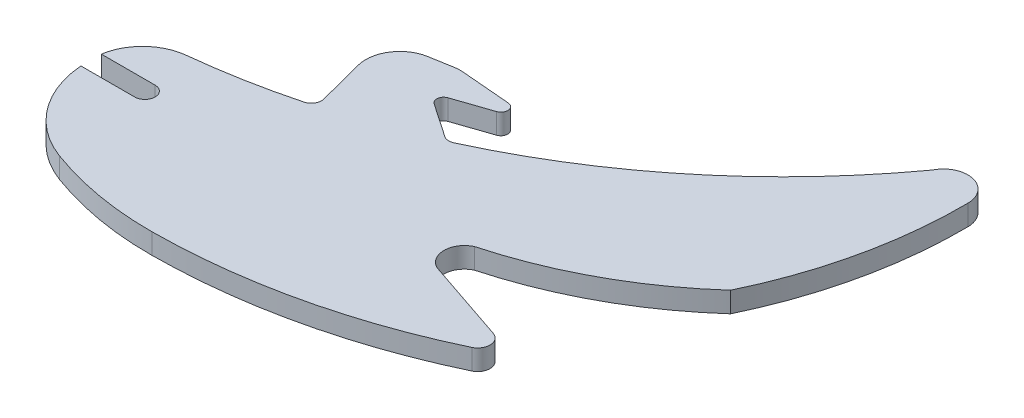
ISO-10303-21;
HEADER;
FILE_DESCRIPTION(('STEP AP214'),'2;1');
FILE_NAME('part.step','',(''),(''),'','','');
FILE_SCHEMA(('AUTOMOTIVE_DESIGN { 1 0 10303 214 1 1 1 1 }'));
ENDSEC;
DATA;
#1=APPLICATION_CONTEXT('core data for automotive mechanical design processes');
#2=APPLICATION_PROTOCOL_DEFINITION('international standard','automotive_design',2000,#1);
#3=PRODUCT_CONTEXT('',#1,'mechanical');
#4=PRODUCT('Part','Part','',(#3));
#5=PRODUCT_RELATED_PRODUCT_CATEGORY('part','',(#4));
#6=PRODUCT_DEFINITION_FORMATION('','',#4);
#7=PRODUCT_DEFINITION_CONTEXT('part definition',#1,'design');
#8=PRODUCT_DEFINITION('design','',#6,#7);
#9=PRODUCT_DEFINITION_SHAPE('','',#8);
#10=(LENGTH_UNIT() NAMED_UNIT(*) SI_UNIT(.MILLI.,.METRE.));
#11=(NAMED_UNIT(*) PLANE_ANGLE_UNIT() SI_UNIT($,.RADIAN.));
#12=(NAMED_UNIT(*) SI_UNIT($,.STERADIAN.) SOLID_ANGLE_UNIT());
#13=UNCERTAINTY_MEASURE_WITH_UNIT(LENGTH_MEASURE(1.E-05),#10,'distance_accuracy_value','');
#14=(GEOMETRIC_REPRESENTATION_CONTEXT(3) GLOBAL_UNCERTAINTY_ASSIGNED_CONTEXT((#13)) GLOBAL_UNIT_ASSIGNED_CONTEXT((#10,
#11,#12)) REPRESENTATION_CONTEXT('',''));
#15=CARTESIAN_POINT('',(0.,0.,0.));
#16=DIRECTION('',(0.,0.,1.));
#17=DIRECTION('',(1.,0.,0.));
#18=AXIS2_PLACEMENT_3D('',#15,#16,#17);
#19=CARTESIAN_POINT('',(15.0022596641615,3.,-1.16573840127619));
#20=DIRECTION('',(0.,-1.,0.));
#21=DIRECTION('',(0.,0.,-1.));
#22=AXIS2_PLACEMENT_3D('',#19,#20,#21);
#23=CYLINDRICAL_SURFACE('',#22,15.0474828809052);
#24=CARTESIAN_POINT('',(15.0022596641615,0.,-1.16573840127619));
#25=DIRECTION('',(0.,1.,0.));
#26=DIRECTION('',(0.,0.,-1.));
#27=AXIS2_PLACEMENT_3D('',#24,#25,#26);
#28=CIRCLE('',#27,15.0474828809052);
#29=CARTESIAN_POINT('',(0.,0.,0.));
#30=VERTEX_POINT('',#29);
#31=CARTESIAN_POINT('',(9.79621068654147,0.,12.952469526565));
#32=VERTEX_POINT('',#31);
#33=EDGE_CURVE('E230',#30,#32,#28,.T.);
#34=ORIENTED_EDGE('',*,*,#33,.T.);
#35=DIRECTION('',(0.,-1.,0.));
#36=VECTOR('',#35,1.);
#37=CARTESIAN_POINT('',(9.79621068654147,3.,12.952469526565));
#38=LINE('',#37,#36);
#39=CARTESIAN_POINT('',(9.79621068654147,3.,12.952469526565));
#40=VERTEX_POINT('',#39);
#41=EDGE_CURVE('E210',#40,#32,#38,.T.);
#42=ORIENTED_EDGE('',*,*,#41,.F.);
#43=CARTESIAN_POINT('',(15.0022596641615,3.,-1.16573840127619));
#44=DIRECTION('',(0.,1.,0.));
#45=DIRECTION('',(0.,0.,-1.));
#46=AXIS2_PLACEMENT_3D('',#43,#44,#45);
#47=CIRCLE('',#46,15.0474828809052);
#48=CARTESIAN_POINT('',(0.,3.,0.));
#49=VERTEX_POINT('',#48);
#50=EDGE_CURVE('E217',#49,#40,#47,.T.);
#51=ORIENTED_EDGE('',*,*,#50,.F.);
#52=DIRECTION('',(0.,-1.,0.));
#53=VECTOR('',#52,1.);
#54=CARTESIAN_POINT('',(0.,3.,0.));
#55=LINE('',#54,#53);
#56=EDGE_CURVE('E343',#49,#30,#55,.T.);
#57=ORIENTED_EDGE('',*,*,#56,.T.);
#58=EDGE_LOOP('',(#34,#42,#51,#57));
#59=FACE_BOUND('',#58,.T.);
#60=ADVANCED_FACE('F33',(#59),#23,.T.);
#61=CARTESIAN_POINT('',(25.8696241510259,3.,-30.636784892147));
#62=DIRECTION('',(0.,-1.,0.));
#63=DIRECTION('',(0.,0.,-1.));
#64=AXIS2_PLACEMENT_3D('',#61,#62,#63);
#65=CYLINDRICAL_SURFACE('',#64,46.4583439349647);
#66=CARTESIAN_POINT('',(25.8696241510259,0.,-30.636784892147));
#67=DIRECTION('',(0.,1.,0.));
#68=DIRECTION('',(0.,0.,1.));
#69=AXIS2_PLACEMENT_3D('',#66,#67,#68);
#70=CIRCLE('',#69,46.4583439349647);
#71=CARTESIAN_POINT('',(26.1997675387388,0.,15.8203859916145));
#72=VERTEX_POINT('',#71);
#73=EDGE_CURVE('E390',#32,#72,#70,.T.);
#74=ORIENTED_EDGE('',*,*,#73,.T.);
#75=DIRECTION('',(0.,-1.,0.));
#76=VECTOR('',#75,1.);
#77=CARTESIAN_POINT('',(26.1997675387388,3.,15.8203859916145));
#78=LINE('',#77,#76);
#79=CARTESIAN_POINT('',(26.1997675387388,3.,15.8203859916145));
#80=VERTEX_POINT('',#79);
#81=EDGE_CURVE('E213',#80,#72,#78,.T.);
#82=ORIENTED_EDGE('',*,*,#81,.F.);
#83=CARTESIAN_POINT('',(25.8696241510259,3.,-30.636784892147));
#84=DIRECTION('',(0.,1.,0.));
#85=DIRECTION('',(0.,0.,1.));
#86=AXIS2_PLACEMENT_3D('',#83,#84,#85);
#87=CIRCLE('',#86,46.4583439349647);
#88=EDGE_CURVE('E206',#40,#80,#87,.T.);
#89=ORIENTED_EDGE('',*,*,#88,.F.);
#90=ORIENTED_EDGE('',*,*,#41,.T.);
#91=EDGE_LOOP('',(#74,#82,#89,#90));
#92=FACE_BOUND('',#91,.T.);
#93=ADVANCED_FACE('F208',(#92),#65,.T.);
#94=CARTESIAN_POINT('',(25.5592661085871,3.,-74.3097983443123));
#95=DIRECTION('',(0.,-1.,0.));
#96=DIRECTION('',(0.,0.,-1.));
#97=AXIS2_PLACEMENT_3D('',#94,#95,#96);
#98=CYLINDRICAL_SURFACE('',#97,90.1324601379002);
#99=CARTESIAN_POINT('',(25.5592661085871,0.,-74.3097983443123));
#100=DIRECTION('',(0.,1.,0.));
#101=DIRECTION('',(0.,0.,-1.));
#102=AXIS2_PLACEMENT_3D('',#99,#100,#101);
#103=CIRCLE('',#102,90.1324601379002);
#104=CARTESIAN_POINT('',(64.3035336526489,0.,7.0704333030868));
#105=VERTEX_POINT('',#104);
#106=EDGE_CURVE('E384',#72,#105,#103,.T.);
#107=ORIENTED_EDGE('',*,*,#106,.T.);
#108=DIRECTION('',(0.,-1.,0.));
#109=VECTOR('',#108,1.);
#110=CARTESIAN_POINT('',(64.3035336526489,3.,7.0704333030868));
#111=LINE('',#110,#109);
#112=CARTESIAN_POINT('',(64.3035336526489,3.,7.0704333030868));
#113=VERTEX_POINT('',#112);
#114=EDGE_CURVE('E235',#113,#105,#111,.T.);
#115=ORIENTED_EDGE('',*,*,#114,.F.);
#116=CARTESIAN_POINT('',(25.5592661085871,3.,-74.3097983443123));
#117=DIRECTION('',(0.,1.,0.));
#118=DIRECTION('',(0.,0.,-1.));
#119=AXIS2_PLACEMENT_3D('',#116,#117,#118);
#120=CIRCLE('',#119,90.1324601379002);
#121=EDGE_CURVE('E216',#80,#113,#120,.T.);
#122=ORIENTED_EDGE('',*,*,#121,.F.);
#123=ORIENTED_EDGE('',*,*,#81,.T.);
#124=EDGE_LOOP('',(#107,#115,#122,#123));
#125=FACE_BOUND('',#124,.T.);
#126=ADVANCED_FACE('F431',(#125),#98,.T.);
#127=CARTESIAN_POINT('',(63.5252762187453,3.,5.43574579272534));
#128=DIRECTION('',(0.,-1.,0.));
#129=DIRECTION('',(0.,0.,-1.));
#130=AXIS2_PLACEMENT_3D('',#127,#128,#129);
#131=CYLINDRICAL_SURFACE('',#130,1.81049382488807);
#132=CARTESIAN_POINT('',(63.5252762187453,0.,5.43574579272534));
#133=DIRECTION('',(0.,1.,0.));
#134=DIRECTION('',(0.,0.,-1.));
#135=AXIS2_PLACEMENT_3D('',#132,#133,#134);
#136=CIRCLE('',#135,1.81049382488807);
#137=CARTESIAN_POINT('',(64.1048712887622,0.,3.72053226526878));
#138=VERTEX_POINT('',#137);
#139=EDGE_CURVE('E379',#105,#138,#136,.T.);
#140=ORIENTED_EDGE('',*,*,#139,.T.);
#141=DIRECTION('',(0.,-1.,0.));
#142=VECTOR('',#141,1.);
#143=CARTESIAN_POINT('',(64.1048712887622,3.,3.72053226526878));
#144=LINE('',#143,#142);
#145=CARTESIAN_POINT('',(64.1048712887622,3.,3.72053226526878));
#146=VERTEX_POINT('',#145);
#147=EDGE_CURVE('E370',#146,#138,#144,.T.);
#148=ORIENTED_EDGE('',*,*,#147,.F.);
#149=CARTESIAN_POINT('',(63.5252762187453,3.,5.43574579272534));
#150=DIRECTION('',(0.,1.,0.));
#151=DIRECTION('',(0.,0.,-1.));
#152=AXIS2_PLACEMENT_3D('',#149,#150,#151);
#153=CIRCLE('',#152,1.81049382488807);
#154=EDGE_CURVE('E380',#113,#146,#153,.T.);
#155=ORIENTED_EDGE('',*,*,#154,.F.);
#156=ORIENTED_EDGE('',*,*,#114,.T.);
#157=EDGE_LOOP('',(#140,#148,#155,#156));
#158=FACE_BOUND('',#157,.T.);
#159=ADVANCED_FACE('F377',(#158),#131,.T.);
#160=CARTESIAN_POINT('',(51.706470786583,3.,-0.469063777513008));
#161=DIRECTION('',(-0.320130928948462,0.,0.947373309910404));
#162=DIRECTION('',(0.947373309910404,0.,0.320130928948462));
#163=AXIS2_PLACEMENT_3D('',#160,#161,#162);
#164=PLANE('',#163);
#165=DIRECTION('',(-0.947373309910404,0.,-0.320130928948462));
#166=VECTOR('',#165,1.);
#167=CARTESIAN_POINT('',(51.706470786583,0.,-0.469063777513008));
#168=LINE('',#167,#166);
#169=CARTESIAN_POINT('',(51.706470786583,0.,-0.469063777513016));
#170=VERTEX_POINT('',#169);
#171=EDGE_CURVE('E386',#138,#170,#168,.T.);
#172=ORIENTED_EDGE('',*,*,#171,.T.);
#173=DIRECTION('',(0.,-1.,0.));
#174=VECTOR('',#173,1.);
#175=CARTESIAN_POINT('',(51.706470786583,3.,-0.469063777513016));
#176=LINE('',#175,#174);
#177=CARTESIAN_POINT('',(51.706470786583,3.,-0.469063777513016));
#178=VERTEX_POINT('',#177);
#179=EDGE_CURVE('E367',#178,#170,#176,.T.);
#180=ORIENTED_EDGE('',*,*,#179,.F.);
#181=DIRECTION('',(-0.947373309910404,0.,-0.320130928948462));
#182=VECTOR('',#181,1.);
#183=CARTESIAN_POINT('',(51.706470786583,3.,-0.469063777513008));
#184=LINE('',#183,#182);
#185=EDGE_CURVE('E433',#146,#178,#184,.T.);
#186=ORIENTED_EDGE('',*,*,#185,.F.);
#187=ORIENTED_EDGE('',*,*,#147,.T.);
#188=EDGE_LOOP('',(#172,#180,#186,#187));
#189=FACE_BOUND('',#188,.T.);
#190=ADVANCED_FACE('F448',(#189),#164,.F.);
#191=CARTESIAN_POINT('',(52.97,3.,-3.19000000000001));
#192=DIRECTION('',(0.,-1.,0.));
#193=DIRECTION('',(0.,0.,-1.));
#194=AXIS2_PLACEMENT_3D('',#191,#192,#193);
#195=CYLINDRICAL_SURFACE('',#194,3.);
#196=CARTESIAN_POINT('',(52.97,0.,-3.19000000000001));
#197=DIRECTION('',(0.,-1.,0.));
#198=DIRECTION('',(0.,0.,1.));
#199=AXIS2_PLACEMENT_3D('',#196,#197,#198);
#200=CIRCLE('',#199,3.);
#201=CARTESIAN_POINT('',(51.706470786583,0.,-5.91093622248697));
#202=VERTEX_POINT('',#201);
#203=EDGE_CURVE('E388',#170,#202,#200,.T.);
#204=ORIENTED_EDGE('',*,*,#203,.T.);
#205=DIRECTION('',(0.,-1.,0.));
#206=VECTOR('',#205,1.);
#207=CARTESIAN_POINT('',(51.706470786583,3.,-5.91093622248697));
#208=LINE('',#207,#206);
#209=CARTESIAN_POINT('',(51.706470786583,3.,-5.91093622248697));
#210=VERTEX_POINT('',#209);
#211=EDGE_CURVE('E364',#210,#202,#208,.T.);
#212=ORIENTED_EDGE('',*,*,#211,.F.);
#213=CARTESIAN_POINT('',(52.97,3.,-3.19000000000001));
#214=DIRECTION('',(0.,-1.,0.));
#215=DIRECTION('',(0.,0.,1.));
#216=AXIS2_PLACEMENT_3D('',#213,#214,#215);
#217=CIRCLE('',#216,3.);
#218=EDGE_CURVE('E437',#178,#210,#217,.T.);
#219=ORIENTED_EDGE('',*,*,#218,.F.);
#220=ORIENTED_EDGE('',*,*,#179,.T.);
#221=EDGE_LOOP('',(#204,#212,#219,#220));
#222=FACE_BOUND('',#221,.T.);
#223=ADVANCED_FACE('F444',(#222),#195,.F.);
#224=CARTESIAN_POINT('',(36.0061897025687,3.,-63.6967865995264));
#225=DIRECTION('',(0.,-1.,0.));
#226=DIRECTION('',(0.,0.,-1.));
#227=AXIS2_PLACEMENT_3D('',#224,#225,#226);
#228=CYLINDRICAL_SURFACE('',#227,59.8807425631533);
#229=CARTESIAN_POINT('',(36.0061897025687,0.,-63.6967865995264));
#230=DIRECTION('',(0.,1.,0.));
#231=DIRECTION('',(0.,0.,1.));
#232=AXIS2_PLACEMENT_3D('',#229,#230,#231);
#233=CIRCLE('',#232,59.8807425631533);
#234=CARTESIAN_POINT('',(76.,0.,-19.13));
#235=VERTEX_POINT('',#234);
#236=EDGE_CURVE('E395',#202,#235,#233,.T.);
#237=ORIENTED_EDGE('',*,*,#236,.T.);
#238=DIRECTION('',(0.,-1.,0.));
#239=VECTOR('',#238,1.);
#240=CARTESIAN_POINT('',(76.,3.,-19.13));
#241=LINE('',#240,#239);
#242=CARTESIAN_POINT('',(76.,3.,-19.13));
#243=VERTEX_POINT('',#242);
#244=EDGE_CURVE('E361',#243,#235,#241,.T.);
#245=ORIENTED_EDGE('',*,*,#244,.F.);
#246=CARTESIAN_POINT('',(36.0061897025687,3.,-63.6967865995264));
#247=DIRECTION('',(0.,1.,0.));
#248=DIRECTION('',(0.,0.,1.));
#249=AXIS2_PLACEMENT_3D('',#246,#247,#248);
#250=CIRCLE('',#249,59.8807425631533);
#251=EDGE_CURVE('E410',#210,#243,#250,.T.);
#252=ORIENTED_EDGE('',*,*,#251,.F.);
#253=ORIENTED_EDGE('',*,*,#211,.T.);
#254=EDGE_LOOP('',(#237,#245,#252,#253));
#255=FACE_BOUND('',#254,.T.);
#256=ADVANCED_FACE('F442',(#255),#228,.T.);
#257=CARTESIAN_POINT('',(18.2287047923147,3.,-46.9268736154697));
#258=DIRECTION('',(0.,-1.,0.));
#259=DIRECTION('',(0.,0.,-1.));
#260=AXIS2_PLACEMENT_3D('',#257,#258,#259);
#261=CYLINDRICAL_SURFACE('',#260,64.1107536437368);
#262=CARTESIAN_POINT('',(18.2287047923147,0.,-46.9268736154697));
#263=DIRECTION('',(0.,1.,0.));
#264=DIRECTION('',(0.,0.,-1.));
#265=AXIS2_PLACEMENT_3D('',#262,#263,#264);
#266=CIRCLE('',#265,64.1107536437368);
#267=CARTESIAN_POINT('',(82.336251948808,0.,-47.5680680835501));
#268=VERTEX_POINT('',#267);
#269=EDGE_CURVE('E321',#235,#268,#266,.T.);
#270=ORIENTED_EDGE('',*,*,#269,.T.);
#271=DIRECTION('',(0.,-1.,0.));
#272=VECTOR('',#271,1.);
#273=CARTESIAN_POINT('',(82.336251948808,3.,-47.5680680835501));
#274=LINE('',#273,#272);
#275=CARTESIAN_POINT('',(82.336251948808,3.,-47.5680680835501));
#276=VERTEX_POINT('',#275);
#277=EDGE_CURVE('E358',#276,#268,#274,.T.);
#278=ORIENTED_EDGE('',*,*,#277,.F.);
#279=CARTESIAN_POINT('',(18.2287047923147,3.,-46.9268736154697));
#280=DIRECTION('',(0.,1.,0.));
#281=DIRECTION('',(0.,0.,-1.));
#282=AXIS2_PLACEMENT_3D('',#279,#280,#281);
#283=CIRCLE('',#282,64.1107536437368);
#284=EDGE_CURVE('E407',#243,#276,#283,.T.);
#285=ORIENTED_EDGE('',*,*,#284,.F.);
#286=ORIENTED_EDGE('',*,*,#244,.T.);
#287=EDGE_LOOP('',(#270,#278,#285,#286));
#288=FACE_BOUND('',#287,.T.);
#289=ADVANCED_FACE('F399',(#288),#261,.T.);
#290=CARTESIAN_POINT('',(78.7413895259523,3.,-47.532112786533));
#291=DIRECTION('',(0.,-1.,0.));
#292=DIRECTION('',(0.,0.,-1.));
#293=AXIS2_PLACEMENT_3D('',#290,#291,#292);
#294=CYLINDRICAL_SURFACE('',#293,3.59504222821422);
#295=CARTESIAN_POINT('',(78.7413895259523,0.,-47.532112786533));
#296=DIRECTION('',(0.,1.,0.));
#297=DIRECTION('',(0.,0.,-1.));
#298=AXIS2_PLACEMENT_3D('',#295,#296,#297);
#299=CIRCLE('',#298,3.59504222821422);
#300=CARTESIAN_POINT('',(75.506260732768,0.,-49.1));
#301=VERTEX_POINT('',#300);
#302=EDGE_CURVE('E317',#268,#301,#299,.T.);
#303=ORIENTED_EDGE('',*,*,#302,.T.);
#304=DIRECTION('',(0.,-1.,0.));
#305=VECTOR('',#304,1.);
#306=CARTESIAN_POINT('',(75.506260732768,3.,-49.1));
#307=LINE('',#306,#305);
#308=CARTESIAN_POINT('',(75.506260732768,3.,-49.1));
#309=VERTEX_POINT('',#308);
#310=EDGE_CURVE('E316',#309,#301,#307,.T.);
#311=ORIENTED_EDGE('',*,*,#310,.F.);
#312=CARTESIAN_POINT('',(78.7413895259523,3.,-47.532112786533));
#313=DIRECTION('',(0.,1.,0.));
#314=DIRECTION('',(0.,0.,-1.));
#315=AXIS2_PLACEMENT_3D('',#312,#313,#314);
#316=CIRCLE('',#315,3.59504222821422);
#317=EDGE_CURVE('E406',#276,#309,#316,.T.);
#318=ORIENTED_EDGE('',*,*,#317,.F.);
#319=ORIENTED_EDGE('',*,*,#277,.T.);
#320=EDGE_LOOP('',(#303,#311,#318,#319));
#321=FACE_BOUND('',#320,.T.);
#322=ADVANCED_FACE('F405',(#321),#294,.T.);
#323=CARTESIAN_POINT('',(-4.20000000000001,3.,-107.04));
#324=DIRECTION('',(0.,-1.,0.));
#325=DIRECTION('',(0.,0.,-1.));
#326=AXIS2_PLACEMENT_3D('',#323,#324,#325);
#327=CYLINDRICAL_SURFACE('',#326,98.54);
#328=CARTESIAN_POINT('',(-4.20000000000001,0.,-107.04));
#329=DIRECTION('',(0.,-1.,0.));
#330=DIRECTION('',(0.,0.,-1.));
#331=AXIS2_PLACEMENT_3D('',#328,#329,#330);
#332=CIRCLE('',#331,98.54);
#333=CARTESIAN_POINT('',(37.0759782786197,0.,-17.5613700532752));
#334=VERTEX_POINT('',#333);
#335=EDGE_CURVE('E310',#301,#334,#332,.T.);
#336=ORIENTED_EDGE('',*,*,#335,.T.);
#337=DIRECTION('',(0.,-1.,0.));
#338=VECTOR('',#337,1.);
#339=CARTESIAN_POINT('',(37.0759782786197,3.,-17.5613700532752));
#340=LINE('',#339,#338);
#341=CARTESIAN_POINT('',(37.0759782786197,3.,-17.5613700532752));
#342=VERTEX_POINT('',#341);
#343=EDGE_CURVE('E279',#334,#342,#340,.F.);
#344=ORIENTED_EDGE('',*,*,#343,.T.);
#345=CARTESIAN_POINT('',(-4.20000000000001,3.,-107.04));
#346=DIRECTION('',(0.,-1.,0.));
#347=DIRECTION('',(0.,0.,-1.));
#348=AXIS2_PLACEMENT_3D('',#345,#346,#347);
#349=CIRCLE('',#348,98.54);
#350=EDGE_CURVE('E293',#309,#342,#349,.T.);
#351=ORIENTED_EDGE('',*,*,#350,.F.);
#352=ORIENTED_EDGE('',*,*,#310,.T.);
#353=EDGE_LOOP('',(#336,#344,#351,#352));
#354=FACE_BOUND('',#353,.T.);
#355=ADVANCED_FACE('F314',(#354),#327,.F.);
#356=CARTESIAN_POINT('',(29.01,3.,-22.19));
#357=DIRECTION('',(-0.564269226324747,0.,0.825590843107451));
#358=DIRECTION('',(0.825590843107451,0.,0.564269226324747));
#359=AXIS2_PLACEMENT_3D('',#356,#357,#358);
#360=PLANE('',#359);
#361=DIRECTION('',(-0.825590843107451,0.,-0.564269226324747));
#362=VECTOR('',#361,1.);
#363=CARTESIAN_POINT('',(29.01,3.,-22.19));
#364=LINE('',#363,#362);
#365=CARTESIAN_POINT('',(35.6012613945016,3.,-17.685049395678));
#366=VERTEX_POINT('',#365);
#367=CARTESIAN_POINT('',(30.6595337584644,3.,-21.0625878618252));
#368=VERTEX_POINT('',#367);
#369=EDGE_CURVE('E291',#366,#368,#364,.T.);
#370=ORIENTED_EDGE('',*,*,#369,.F.);
#371=DIRECTION('',(0.,1.,0.));
#372=VECTOR('',#371,1.);
#373=CARTESIAN_POINT('',(35.6012613945016,0.,-17.685049395678));
#374=LINE('',#373,#372);
#375=CARTESIAN_POINT('',(35.6012613945016,0.,-17.685049395678));
#376=VERTEX_POINT('',#375);
#377=EDGE_CURVE('E276',#366,#376,#374,.F.);
#378=ORIENTED_EDGE('',*,*,#377,.T.);
#379=DIRECTION('',(-0.825590843107451,0.,-0.564269226324747));
#380=VECTOR('',#379,1.);
#381=CARTESIAN_POINT('',(29.01,0.,-22.19));
#382=LINE('',#381,#380);
#383=CARTESIAN_POINT('',(30.6595337584644,0.,-21.0625878618252));
#384=VERTEX_POINT('',#383);
#385=EDGE_CURVE('E311',#376,#384,#382,.T.);
#386=ORIENTED_EDGE('',*,*,#385,.T.);
#387=DIRECTION('',(0.,-1.,0.));
#388=VECTOR('',#387,1.);
#389=CARTESIAN_POINT('',(30.6595337584644,3.,-21.0625878618252));
#390=LINE('',#389,#388);
#391=EDGE_CURVE('E268',#384,#368,#390,.F.);
#392=ORIENTED_EDGE('',*,*,#391,.T.);
#393=EDGE_LOOP('',(#370,#378,#386,#392));
#394=FACE_BOUND('',#393,.T.);
#395=ADVANCED_FACE('F298',(#394),#360,.F.);
#396=CARTESIAN_POINT('',(40.7435916727496,3.,-26.19));
#397=DIRECTION('',(-0.32266756312155,0.,-0.946512357927354));
#398=DIRECTION('',(-0.946512357927355,0.,0.32266756312155));
#399=AXIS2_PLACEMENT_3D('',#396,#397,#398);
#400=PLANE('',#399);
#401=DIRECTION('',(0.946512357927355,0.,-0.32266756312155));
#402=VECTOR('',#401,1.);
#403=CARTESIAN_POINT('',(40.7435916727496,0.,-26.19));
#404=LINE('',#403,#402);
#405=CARTESIAN_POINT('',(30.9011354216676,0.,-22.83469106286));
#406=VERTEX_POINT('',#405);
#407=CARTESIAN_POINT('',(36.2255149655428,0.,-24.6497804889701));
#408=VERTEX_POINT('',#407);
#409=EDGE_CURVE('E319',#406,#408,#404,.T.);
#410=ORIENTED_EDGE('',*,*,#409,.T.);
#411=DIRECTION('',(0.,-1.,0.));
#412=VECTOR('',#411,1.);
#413=CARTESIAN_POINT('',(36.2255149655428,3.,-24.6497804889701));
#414=LINE('',#413,#412);
#415=CARTESIAN_POINT('',(36.2255149655428,3.,-24.6497804889701));
#416=VERTEX_POINT('',#415);
#417=EDGE_CURVE('E264',#408,#416,#414,.F.);
#418=ORIENTED_EDGE('',*,*,#417,.T.);
#419=DIRECTION('',(0.946512357927355,0.,-0.32266756312155));
#420=VECTOR('',#419,1.);
#421=CARTESIAN_POINT('',(40.7435916727496,3.,-26.19));
#422=LINE('',#421,#420);
#423=CARTESIAN_POINT('',(30.9011354216676,3.,-22.83469106286));
#424=VERTEX_POINT('',#423);
#425=EDGE_CURVE('E302',#424,#416,#422,.T.);
#426=ORIENTED_EDGE('',*,*,#425,.F.);
#427=DIRECTION('',(0.,-1.,0.));
#428=VECTOR('',#427,1.);
#429=CARTESIAN_POINT('',(30.9011354216676,0.,-22.83469106286));
#430=LINE('',#429,#428);
#431=EDGE_CURVE('E261',#424,#406,#430,.T.);
#432=ORIENTED_EDGE('',*,*,#431,.T.);
#433=EDGE_LOOP('',(#410,#418,#426,#432));
#434=FACE_BOUND('',#433,.T.);
#435=ADVANCED_FACE('F538',(#434),#400,.F.);
#436=CARTESIAN_POINT('',(28.1064549848591,3.,-27.26));
#437=DIRECTION('',(-0.0843691897568543,0.,0.996434563742031));
#438=DIRECTION('',(0.996434563742031,0.,0.0843691897568543));
#439=AXIS2_PLACEMENT_3D('',#436,#437,#438);
#440=PLANE('',#439);
#441=DIRECTION('',(-0.996434563742031,0.,-0.0843691897568543));
#442=VECTOR('',#441,1.);
#443=CARTESIAN_POINT('',(28.1064549848591,3.,-27.26));
#444=LINE('',#443,#442);
#445=CARTESIAN_POINT('',(35.9872165921782,3.,-26.5927274106395));
#446=VERTEX_POINT('',#445);
#447=CARTESIAN_POINT('',(28.745827308872,3.,-27.2058636553841));
#448=VERTEX_POINT('',#447);
#449=EDGE_CURVE('E415',#446,#448,#444,.T.);
#450=ORIENTED_EDGE('',*,*,#449,.F.);
#451=DIRECTION('',(0.,-1.,0.));
#452=VECTOR('',#451,1.);
#453=CARTESIAN_POINT('',(35.9872165921782,3.,-26.5927274106395));
#454=LINE('',#453,#452);
#455=CARTESIAN_POINT('',(35.9872165921782,0.,-26.5927274106395));
#456=VERTEX_POINT('',#455);
#457=EDGE_CURVE('E256',#446,#456,#454,.T.);
#458=ORIENTED_EDGE('',*,*,#457,.T.);
#459=DIRECTION('',(-0.996434563742031,0.,-0.0843691897568543));
#460=VECTOR('',#459,1.);
#461=CARTESIAN_POINT('',(28.1064549848591,0.,-27.26));
#462=LINE('',#461,#460);
#463=CARTESIAN_POINT('',(28.745827308872,0.,-27.2058636553841));
#464=VERTEX_POINT('',#463);
#465=EDGE_CURVE('E327',#456,#464,#462,.T.);
#466=ORIENTED_EDGE('',*,*,#465,.T.);
#467=DIRECTION('',(0.,-1.,0.));
#468=VECTOR('',#467,1.);
#469=CARTESIAN_POINT('',(28.745827308872,3.,-27.2058636553841));
#470=LINE('',#469,#468);
#471=EDGE_CURVE('E246',#464,#448,#470,.F.);
#472=ORIENTED_EDGE('',*,*,#471,.T.);
#473=EDGE_LOOP('',(#450,#458,#466,#472));
#474=FACE_BOUND('',#473,.T.);
#475=ADVANCED_FACE('F534',(#474),#440,.F.);
#476=CARTESIAN_POINT('',(18.83,3.,-25.66));
#477=DIRECTION('',(0.169969971289486,0.,0.985449242152964));
#478=DIRECTION('',(0.985449242152964,0.,-0.169969971289486));
#479=AXIS2_PLACEMENT_3D('',#476,#477,#478);
#480=PLANE('',#479);
#481=DIRECTION('',(-0.985449242152964,0.,0.169969971289486));
#482=VECTOR('',#481,1.);
#483=CARTESIAN_POINT('',(18.83,3.,-25.66));
#484=LINE('',#483,#482);
#485=CARTESIAN_POINT('',(27.4741315036403,3.,-27.1509370474387));
#486=VERTEX_POINT('',#485);
#487=CARTESIAN_POINT('',(24.1934142800802,3.,-26.5850799860652));
#488=VERTEX_POINT('',#487);
#489=EDGE_CURVE('E417',#486,#488,#484,.T.);
#490=ORIENTED_EDGE('',*,*,#489,.F.);
#491=DIRECTION('',(0.,-1.,0.));
#492=VECTOR('',#491,1.);
#493=CARTESIAN_POINT('',(27.4741315036403,3.,-27.1509370474387));
#494=LINE('',#493,#492);
#495=CARTESIAN_POINT('',(27.4741315036403,0.,-27.1509370474387));
#496=VERTEX_POINT('',#495);
#497=EDGE_CURVE('E233',#486,#496,#494,.T.);
#498=ORIENTED_EDGE('',*,*,#497,.T.);
#499=DIRECTION('',(-0.985449242152964,0.,0.169969971289486));
#500=VECTOR('',#499,1.);
#501=CARTESIAN_POINT('',(18.83,0.,-25.66));
#502=LINE('',#501,#500);
#503=CARTESIAN_POINT('',(24.1934142800802,0.,-26.5850799860652));
#504=VERTEX_POINT('',#503);
#505=EDGE_CURVE('E329',#496,#504,#502,.T.);
#506=ORIENTED_EDGE('',*,*,#505,.T.);
#507=DIRECTION('',(0.,-1.,0.));
#508=VECTOR('',#507,1.);
#509=CARTESIAN_POINT('',(24.1934142800802,3.,-26.5850799860652));
#510=LINE('',#509,#508);
#511=EDGE_CURVE('E231',#504,#488,#510,.F.);
#512=ORIENTED_EDGE('',*,*,#511,.T.);
#513=EDGE_LOOP('',(#490,#498,#506,#512));
#514=FACE_BOUND('',#513,.T.);
#515=ADVANCED_FACE('F531',(#514),#480,.F.);
#516=CARTESIAN_POINT('',(18.83,3.,-25.66));
#517=DIRECTION('',(0.967532456457048,0.,-0.252746801566688));
#518=DIRECTION('',(-0.252746801566688,0.,-0.967532456457048));
#519=AXIS2_PLACEMENT_3D('',#516,#517,#518);
#520=PLANE('',#519);
#521=DIRECTION('',(0.252746801566688,0.,0.967532456457048));
#522=VECTOR('',#521,1.);
#523=CARTESIAN_POINT('',(18.83,0.,-25.66));
#524=LINE('',#523,#522);
#525=CARTESIAN_POINT('',(20.2056018542424,0.,-20.394099767467));
#526=VERTEX_POINT('',#525);
#527=CARTESIAN_POINT('',(21.984587036092,0.,-13.584019907598));
#528=VERTEX_POINT('',#527);
#529=EDGE_CURVE('E332',#526,#528,#524,.T.);
#530=ORIENTED_EDGE('',*,*,#529,.T.);
#531=DIRECTION('',(0.,1.,0.));
#532=VECTOR('',#531,1.);
#533=CARTESIAN_POINT('',(21.984587036092,3.,-13.584019907598));
#534=LINE('',#533,#532);
#535=CARTESIAN_POINT('',(21.984587036092,3.,-13.584019907598));
#536=VERTEX_POINT('',#535);
#537=EDGE_CURVE('E54',#528,#536,#534,.T.);
#538=ORIENTED_EDGE('',*,*,#537,.T.);
#539=DIRECTION('',(0.252746801566688,0.,0.967532456457048));
#540=VECTOR('',#539,1.);
#541=CARTESIAN_POINT('',(18.83,3.,-25.66));
#542=LINE('',#541,#540);
#543=CARTESIAN_POINT('',(20.2056018542424,3.,-20.394099767467));
#544=VERTEX_POINT('',#543);
#545=EDGE_CURVE('E420',#544,#536,#542,.T.);
#546=ORIENTED_EDGE('',*,*,#545,.F.);
#547=DIRECTION('',(0.,-1.,0.));
#548=VECTOR('',#547,1.);
#549=CARTESIAN_POINT('',(20.2056018542424,3.,-20.394099767467));
#550=LINE('',#549,#548);
#551=EDGE_CURVE('E253',#544,#526,#550,.T.);
#552=ORIENTED_EDGE('',*,*,#551,.T.);
#553=EDGE_LOOP('',(#530,#538,#546,#552));
#554=FACE_BOUND('',#553,.T.);
#555=ADVANCED_FACE('F528',(#554),#520,.F.);
#556=CARTESIAN_POINT('',(-4.20000000000001,3.,-107.04));
#557=DIRECTION('',(0.,-1.,0.));
#558=DIRECTION('',(0.,0.,-1.));
#559=AXIS2_PLACEMENT_3D('',#556,#557,#558);
#560=CYLINDRICAL_SURFACE('',#559,98.54);
#561=CARTESIAN_POINT('',(-4.20000000000001,3.,-107.04));
#562=DIRECTION('',(0.,-1.,0.));
#563=DIRECTION('',(0.,0.,-1.));
#564=AXIS2_PLACEMENT_3D('',#561,#562,#563);
#565=CIRCLE('',#564,98.54);
#566=CARTESIAN_POINT('',(20.9156042265827,3.,-11.7544395811534));
#567=VERTEX_POINT('',#566);
#568=CARTESIAN_POINT('',(6.36,3.,-9.06746303172503));
#569=VERTEX_POINT('',#568);
#570=EDGE_CURVE('E422',#567,#569,#565,.T.);
#571=ORIENTED_EDGE('',*,*,#570,.F.);
#572=DIRECTION('',(0.,-1.,0.));
#573=VECTOR('',#572,1.);
#574=CARTESIAN_POINT('',(20.9156042265827,3.,-11.7544395811534));
#575=LINE('',#574,#573);
#576=CARTESIAN_POINT('',(20.9156042265827,0.,-11.7544395811534));
#577=VERTEX_POINT('',#576);
#578=EDGE_CURVE('E281',#567,#577,#575,.T.);
#579=ORIENTED_EDGE('',*,*,#578,.T.);
#580=CARTESIAN_POINT('',(-4.20000000000001,0.,-107.04));
#581=DIRECTION('',(0.,-1.,0.));
#582=DIRECTION('',(0.,0.,-1.));
#583=AXIS2_PLACEMENT_3D('',#580,#581,#582);
#584=CIRCLE('',#583,98.54);
#585=CARTESIAN_POINT('',(6.36,0.,-9.06746303172503));
#586=VERTEX_POINT('',#585);
#587=EDGE_CURVE('E334',#577,#586,#584,.T.);
#588=ORIENTED_EDGE('',*,*,#587,.T.);
#589=DIRECTION('',(0.,-1.,0.));
#590=VECTOR('',#589,1.);
#591=CARTESIAN_POINT('',(6.36,3.,-9.06746303172503));
#592=LINE('',#591,#590);
#593=EDGE_CURVE('E354',#569,#586,#592,.T.);
#594=ORIENTED_EDGE('',*,*,#593,.F.);
#595=EDGE_LOOP('',(#571,#579,#588,#594));
#596=FACE_BOUND('',#595,.T.);
#597=ADVANCED_FACE('F492',(#596),#560,.F.);
#598=CARTESIAN_POINT('',(7.13368749466462,3.,-1.88942073315336));
#599=DIRECTION('',(0.,-1.,0.));
#600=DIRECTION('',(0.,0.,-1.));
#601=AXIS2_PLACEMENT_3D('',#598,#599,#600);
#602=CYLINDRICAL_SURFACE('',#601,7.21961796631127);
#603=CARTESIAN_POINT('',(7.13368749466462,0.,-1.88942073315336));
#604=DIRECTION('',(0.,1.,0.));
#605=DIRECTION('',(0.,0.,1.));
#606=AXIS2_PLACEMENT_3D('',#603,#604,#605);
#607=CIRCLE('',#606,7.21961796631127);
#608=CARTESIAN_POINT('',(0.,0.,-3.));
#609=VERTEX_POINT('',#608);
#610=EDGE_CURVE('E336',#586,#609,#607,.T.);
#611=ORIENTED_EDGE('',*,*,#610,.T.);
#612=DIRECTION('',(0.,-1.,0.));
#613=VECTOR('',#612,1.);
#614=CARTESIAN_POINT('',(0.,3.,-3.));
#615=LINE('',#614,#613);
#616=CARTESIAN_POINT('',(0.,3.,-3.));
#617=VERTEX_POINT('',#616);
#618=EDGE_CURVE('E351',#617,#609,#615,.T.);
#619=ORIENTED_EDGE('',*,*,#618,.F.);
#620=CARTESIAN_POINT('',(7.13368749466462,3.,-1.88942073315336));
#621=DIRECTION('',(0.,1.,0.));
#622=DIRECTION('',(0.,0.,1.));
#623=AXIS2_PLACEMENT_3D('',#620,#621,#622);
#624=CIRCLE('',#623,7.21961796631127);
#625=EDGE_CURVE('E424',#569,#617,#624,.T.);
#626=ORIENTED_EDGE('',*,*,#625,.F.);
#627=ORIENTED_EDGE('',*,*,#593,.T.);
#628=EDGE_LOOP('',(#611,#619,#626,#627));
#629=FACE_BOUND('',#628,.T.);
#630=ADVANCED_FACE('F497',(#629),#602,.T.);
#631=CARTESIAN_POINT('',(7.87,3.,-3.));
#632=DIRECTION('',(0.,0.,-1.));
#633=DIRECTION('',(-1.,0.,0.));
#634=AXIS2_PLACEMENT_3D('',#631,#632,#633);
#635=PLANE('',#634);
#636=DIRECTION('',(1.,0.,0.));
#637=VECTOR('',#636,1.);
#638=CARTESIAN_POINT('',(7.87,0.,-3.));
#639=LINE('',#638,#637);
#640=CARTESIAN_POINT('',(7.87,0.,-3.));
#641=VERTEX_POINT('',#640);
#642=EDGE_CURVE('E338',#609,#641,#639,.T.);
#643=ORIENTED_EDGE('',*,*,#642,.T.);
#644=DIRECTION('',(0.,-1.,0.));
#645=VECTOR('',#644,1.);
#646=CARTESIAN_POINT('',(7.87,3.,-3.));
#647=LINE('',#646,#645);
#648=CARTESIAN_POINT('',(7.87,3.,-3.));
#649=VERTEX_POINT('',#648);
#650=EDGE_CURVE('E348',#649,#641,#647,.T.);
#651=ORIENTED_EDGE('',*,*,#650,.F.);
#652=DIRECTION('',(1.,0.,0.));
#653=VECTOR('',#652,1.);
#654=CARTESIAN_POINT('',(7.87,3.,-3.));
#655=LINE('',#654,#653);
#656=EDGE_CURVE('E426',#617,#649,#655,.T.);
#657=ORIENTED_EDGE('',*,*,#656,.F.);
#658=ORIENTED_EDGE('',*,*,#618,.T.);
#659=EDGE_LOOP('',(#643,#651,#657,#658));
#660=FACE_BOUND('',#659,.T.);
#661=ADVANCED_FACE('F503',(#660),#635,.F.);
#662=CARTESIAN_POINT('',(7.87,3.,-1.5));
#663=DIRECTION('',(0.,-1.,0.));
#664=DIRECTION('',(0.,0.,-1.));
#665=AXIS2_PLACEMENT_3D('',#662,#663,#664);
#666=CYLINDRICAL_SURFACE('',#665,1.5);
#667=CARTESIAN_POINT('',(7.87,0.,-1.5));
#668=DIRECTION('',(0.,-1.,0.));
#669=DIRECTION('',(0.,0.,1.));
#670=AXIS2_PLACEMENT_3D('',#667,#668,#669);
#671=CIRCLE('',#670,1.5);
#672=CARTESIAN_POINT('',(7.87,0.,0.));
#673=VERTEX_POINT('',#672);
#674=EDGE_CURVE('E340',#641,#673,#671,.T.);
#675=ORIENTED_EDGE('',*,*,#674,.T.);
#676=DIRECTION('',(0.,-1.,0.));
#677=VECTOR('',#676,1.);
#678=CARTESIAN_POINT('',(7.87,3.,0.));
#679=LINE('',#678,#677);
#680=CARTESIAN_POINT('',(7.87,3.,0.));
#681=VERTEX_POINT('',#680);
#682=EDGE_CURVE('E345',#681,#673,#679,.T.);
#683=ORIENTED_EDGE('',*,*,#682,.F.);
#684=CARTESIAN_POINT('',(7.87,3.,-1.5));
#685=DIRECTION('',(0.,-1.,0.));
#686=DIRECTION('',(0.,0.,1.));
#687=AXIS2_PLACEMENT_3D('',#684,#685,#686);
#688=CIRCLE('',#687,1.5);
#689=EDGE_CURVE('E428',#649,#681,#688,.T.);
#690=ORIENTED_EDGE('',*,*,#689,.F.);
#691=ORIENTED_EDGE('',*,*,#650,.T.);
#692=EDGE_LOOP('',(#675,#683,#690,#691));
#693=FACE_BOUND('',#692,.T.);
#694=ADVANCED_FACE('F507',(#693),#666,.F.);
#695=CARTESIAN_POINT('',(0.,3.,0.));
#696=DIRECTION('',(0.,0.,1.));
#697=DIRECTION('',(1.,0.,0.));
#698=AXIS2_PLACEMENT_3D('',#695,#696,#697);
#699=PLANE('',#698);
#700=DIRECTION('',(-1.,0.,0.));
#701=VECTOR('',#700,1.);
#702=CARTESIAN_POINT('',(0.,0.,0.));
#703=LINE('',#702,#701);
#704=EDGE_CURVE('E227',#673,#30,#703,.T.);
#705=ORIENTED_EDGE('',*,*,#704,.T.);
#706=ORIENTED_EDGE('',*,*,#56,.F.);
#707=DIRECTION('',(-1.,0.,0.));
#708=VECTOR('',#707,1.);
#709=CARTESIAN_POINT('',(0.,3.,0.));
#710=LINE('',#709,#708);
#711=EDGE_CURVE('E223',#681,#49,#710,.T.);
#712=ORIENTED_EDGE('',*,*,#711,.F.);
#713=ORIENTED_EDGE('',*,*,#682,.T.);
#714=EDGE_LOOP('',(#705,#706,#712,#713));
#715=FACE_BOUND('',#714,.T.);
#716=ADVANCED_FACE('F510',(#715),#699,.F.);
#717=CARTESIAN_POINT('',(15.0022596641615,3.,-1.16573840127619));
#718=DIRECTION('',(0.,-1.,0.));
#719=DIRECTION('',(0.,0.,-1.));
#720=AXIS2_PLACEMENT_3D('',#717,#718,#719);
#721=PLANE('',#720);
#722=ORIENTED_EDGE('',*,*,#425,.T.);
#723=CARTESIAN_POINT('',(35.9028474024213,3.,-25.5962928468975));
#724=DIRECTION('',(0.,-1.,0.));
#725=DIRECTION('',(0.,0.,-1.));
#726=AXIS2_PLACEMENT_3D('',#723,#724,#725);
#727=CIRCLE('',#726,1.);
#728=EDGE_CURVE('E266',#416,#446,#727,.F.);
#729=ORIENTED_EDGE('',*,*,#728,.T.);
#730=ORIENTED_EDGE('',*,*,#449,.T.);
#731=CARTESIAN_POINT('',(28.3239813600877,3.,-22.2236908366739));
#732=DIRECTION('',(0.,-1.,0.));
#733=DIRECTION('',(0.,0.,-1.));
#734=AXIS2_PLACEMENT_3D('',#731,#732,#733);
#735=CIRCLE('',#734,5.);
#736=EDGE_CURVE('E251',#448,#486,#735,.F.);
#737=ORIENTED_EDGE('',*,*,#736,.T.);
#738=ORIENTED_EDGE('',*,*,#489,.T.);
#739=CARTESIAN_POINT('',(25.0432641365276,3.,-21.6578337753004));
#740=DIRECTION('',(0.,-1.,0.));
#741=DIRECTION('',(0.,0.,-1.));
#742=AXIS2_PLACEMENT_3D('',#739,#740,#741);
#743=CIRCLE('',#742,5.);
#744=EDGE_CURVE('E249',#488,#544,#743,.F.);
#745=ORIENTED_EDGE('',*,*,#744,.T.);
#746=ORIENTED_EDGE('',*,*,#545,.T.);
#747=CARTESIAN_POINT('',(20.5332883514064,3.,-13.2048997052479));
#748=DIRECTION('',(0.,-1.,0.));
#749=DIRECTION('',(0.,0.,-1.));
#750=AXIS2_PLACEMENT_3D('',#747,#748,#749);
#751=CIRCLE('',#750,1.5);
#752=EDGE_CURVE('E11',#536,#567,#751,.T.);
#753=ORIENTED_EDGE('',*,*,#752,.T.);
#754=ORIENTED_EDGE('',*,*,#570,.T.);
#755=ORIENTED_EDGE('',*,*,#625,.T.);
#756=ORIENTED_EDGE('',*,*,#656,.T.);
#757=ORIENTED_EDGE('',*,*,#689,.T.);
#758=ORIENTED_EDGE('',*,*,#711,.T.);
#759=ORIENTED_EDGE('',*,*,#50,.T.);
#760=ORIENTED_EDGE('',*,*,#88,.T.);
#761=ORIENTED_EDGE('',*,*,#121,.T.);
#762=ORIENTED_EDGE('',*,*,#154,.T.);
#763=ORIENTED_EDGE('',*,*,#185,.T.);
#764=ORIENTED_EDGE('',*,*,#218,.T.);
#765=ORIENTED_EDGE('',*,*,#251,.T.);
#766=ORIENTED_EDGE('',*,*,#284,.T.);
#767=ORIENTED_EDGE('',*,*,#317,.T.);
#768=ORIENTED_EDGE('',*,*,#350,.T.);
#769=CARTESIAN_POINT('',(36.4476652339888,3.,-18.9234356603392));
#770=DIRECTION('',(0.,-1.,0.));
#771=DIRECTION('',(0.,0.,-1.));
#772=AXIS2_PLACEMENT_3D('',#769,#770,#771);
#773=CIRCLE('',#772,1.5);
#774=EDGE_CURVE('E287',#342,#366,#773,.T.);
#775=ORIENTED_EDGE('',*,*,#774,.T.);
#776=ORIENTED_EDGE('',*,*,#369,.T.);
#777=CARTESIAN_POINT('',(31.2238029847892,3.,-21.8881787049327));
#778=DIRECTION('',(0.,-1.,0.));
#779=DIRECTION('',(0.,0.,-1.));
#780=AXIS2_PLACEMENT_3D('',#777,#778,#779);
#781=CIRCLE('',#780,1.);
#782=EDGE_CURVE('E274',#368,#424,#781,.T.);
#783=ORIENTED_EDGE('',*,*,#782,.T.);
#784=EDGE_LOOP('',(#722,#729,#730,#737,#738,#745,#746,#753,#754,#755,#756,#757,#758,#759,#760,
#761,#762,#763,#764,#765,#766,#767,#768,#775,#776,#783));
#785=FACE_BOUND('',#784,.T.);
#786=ADVANCED_FACE('F221',(#785),#721,.F.);
#787=CARTESIAN_POINT('',(15.0022596641615,0.,-1.16573840127619));
#788=DIRECTION('',(0.,-1.,0.));
#789=DIRECTION('',(0.,0.,-1.));
#790=AXIS2_PLACEMENT_3D('',#787,#788,#789);
#791=PLANE('',#790);
#792=ORIENTED_EDGE('',*,*,#465,.F.);
#793=CARTESIAN_POINT('',(35.9028474024213,0.,-25.5962928468975));
#794=DIRECTION('',(0.,-1.,0.));
#795=DIRECTION('',(0.,0.,-1.));
#796=AXIS2_PLACEMENT_3D('',#793,#794,#795);
#797=CIRCLE('',#796,1.);
#798=EDGE_CURVE('E259',#456,#408,#797,.T.);
#799=ORIENTED_EDGE('',*,*,#798,.T.);
#800=ORIENTED_EDGE('',*,*,#409,.F.);
#801=CARTESIAN_POINT('',(31.2238029847892,0.,-21.8881787049327));
#802=DIRECTION('',(0.,-1.,0.));
#803=DIRECTION('',(0.,0.,-1.));
#804=AXIS2_PLACEMENT_3D('',#801,#802,#803);
#805=CIRCLE('',#804,1.);
#806=EDGE_CURVE('E271',#406,#384,#805,.F.);
#807=ORIENTED_EDGE('',*,*,#806,.T.);
#808=ORIENTED_EDGE('',*,*,#385,.F.);
#809=CARTESIAN_POINT('',(36.4476652339888,0.,-18.9234356603392));
#810=DIRECTION('',(0.,-1.,0.));
#811=DIRECTION('',(0.,0.,-1.));
#812=AXIS2_PLACEMENT_3D('',#809,#810,#811);
#813=CIRCLE('',#812,1.5);
#814=EDGE_CURVE('E285',#376,#334,#813,.F.);
#815=ORIENTED_EDGE('',*,*,#814,.T.);
#816=ORIENTED_EDGE('',*,*,#335,.F.);
#817=ORIENTED_EDGE('',*,*,#302,.F.);
#818=ORIENTED_EDGE('',*,*,#269,.F.);
#819=ORIENTED_EDGE('',*,*,#236,.F.);
#820=ORIENTED_EDGE('',*,*,#203,.F.);
#821=ORIENTED_EDGE('',*,*,#171,.F.);
#822=ORIENTED_EDGE('',*,*,#139,.F.);
#823=ORIENTED_EDGE('',*,*,#106,.F.);
#824=ORIENTED_EDGE('',*,*,#73,.F.);
#825=ORIENTED_EDGE('',*,*,#33,.F.);
#826=ORIENTED_EDGE('',*,*,#704,.F.);
#827=ORIENTED_EDGE('',*,*,#674,.F.);
#828=ORIENTED_EDGE('',*,*,#642,.F.);
#829=ORIENTED_EDGE('',*,*,#610,.F.);
#830=ORIENTED_EDGE('',*,*,#587,.F.);
#831=CARTESIAN_POINT('',(20.5332883514064,0.,-13.2048997052479));
#832=DIRECTION('',(0.,-1.,0.));
#833=DIRECTION('',(0.,0.,-1.));
#834=AXIS2_PLACEMENT_3D('',#831,#832,#833);
#835=CIRCLE('',#834,1.5);
#836=EDGE_CURVE('E41',#577,#528,#835,.F.);
#837=ORIENTED_EDGE('',*,*,#836,.T.);
#838=ORIENTED_EDGE('',*,*,#529,.F.);
#839=CARTESIAN_POINT('',(25.0432641365276,0.,-21.6578337753004));
#840=DIRECTION('',(0.,-1.,0.));
#841=DIRECTION('',(0.,0.,-1.));
#842=AXIS2_PLACEMENT_3D('',#839,#840,#841);
#843=CIRCLE('',#842,5.);
#844=EDGE_CURVE('E241',#526,#504,#843,.T.);
#845=ORIENTED_EDGE('',*,*,#844,.T.);
#846=ORIENTED_EDGE('',*,*,#505,.F.);
#847=CARTESIAN_POINT('',(28.3239813600877,0.,-22.2236908366739));
#848=DIRECTION('',(0.,-1.,0.));
#849=DIRECTION('',(0.,0.,-1.));
#850=AXIS2_PLACEMENT_3D('',#847,#848,#849);
#851=CIRCLE('',#850,5.);
#852=EDGE_CURVE('E243',#496,#464,#851,.T.);
#853=ORIENTED_EDGE('',*,*,#852,.T.);
#854=EDGE_LOOP('',(#792,#799,#800,#807,#808,#815,#816,#817,#818,#819,#820,#821,#822,#823,#824,
#825,#826,#827,#828,#829,#830,#837,#838,#845,#846,#853));
#855=FACE_BOUND('',#854,.T.);
#856=ADVANCED_FACE('F308',(#855),#791,.T.);
#857=CARTESIAN_POINT('',(28.3239813600877,3.,-22.2236908366739));
#858=DIRECTION('',(0.,-1.,0.));
#859=DIRECTION('',(0.,0.,-1.));
#860=AXIS2_PLACEMENT_3D('',#857,#858,#859);
#861=CYLINDRICAL_SURFACE('',#860,5.);
#862=ORIENTED_EDGE('',*,*,#736,.F.);
#863=ORIENTED_EDGE('',*,*,#471,.F.);
#864=ORIENTED_EDGE('',*,*,#852,.F.);
#865=ORIENTED_EDGE('',*,*,#497,.F.);
#866=EDGE_LOOP('',(#862,#863,#864,#865));
#867=FACE_BOUND('',#866,.T.);
#868=ADVANCED_FACE('F465',(#867),#861,.T.);
#869=CARTESIAN_POINT('',(25.0432641365276,3.,-21.6578337753004));
#870=DIRECTION('',(0.,-1.,0.));
#871=DIRECTION('',(0.,0.,-1.));
#872=AXIS2_PLACEMENT_3D('',#869,#870,#871);
#873=CYLINDRICAL_SURFACE('',#872,5.);
#874=ORIENTED_EDGE('',*,*,#744,.F.);
#875=ORIENTED_EDGE('',*,*,#511,.F.);
#876=ORIENTED_EDGE('',*,*,#844,.F.);
#877=ORIENTED_EDGE('',*,*,#551,.F.);
#878=EDGE_LOOP('',(#874,#875,#876,#877));
#879=FACE_BOUND('',#878,.T.);
#880=ADVANCED_FACE('F468',(#879),#873,.T.);
#881=CARTESIAN_POINT('',(35.9028474024213,3.,-25.5962928468975));
#882=DIRECTION('',(0.,-1.,0.));
#883=DIRECTION('',(0.,0.,-1.));
#884=AXIS2_PLACEMENT_3D('',#881,#882,#883);
#885=CYLINDRICAL_SURFACE('',#884,1.);
#886=ORIENTED_EDGE('',*,*,#728,.F.);
#887=ORIENTED_EDGE('',*,*,#417,.F.);
#888=ORIENTED_EDGE('',*,*,#798,.F.);
#889=ORIENTED_EDGE('',*,*,#457,.F.);
#890=EDGE_LOOP('',(#886,#887,#888,#889));
#891=FACE_BOUND('',#890,.T.);
#892=ADVANCED_FACE('F472',(#891),#885,.T.);
#893=CARTESIAN_POINT('',(31.2238029847892,3.,-21.8881787049327));
#894=DIRECTION('',(0.,1.,0.));
#895=DIRECTION('',(0.,0.,1.));
#896=AXIS2_PLACEMENT_3D('',#893,#894,#895);
#897=CYLINDRICAL_SURFACE('',#896,1.);
#898=ORIENTED_EDGE('',*,*,#782,.F.);
#899=ORIENTED_EDGE('',*,*,#391,.F.);
#900=ORIENTED_EDGE('',*,*,#806,.F.);
#901=ORIENTED_EDGE('',*,*,#431,.F.);
#902=EDGE_LOOP('',(#898,#899,#900,#901));
#903=FACE_BOUND('',#902,.T.);
#904=ADVANCED_FACE('F476',(#903),#897,.F.);
#905=CARTESIAN_POINT('',(36.4476652339888,3.,-18.9234356603392));
#906=DIRECTION('',(0.,-1.,0.));
#907=DIRECTION('',(0.,0.,-1.));
#908=AXIS2_PLACEMENT_3D('',#905,#906,#907);
#909=CYLINDRICAL_SURFACE('',#908,1.5);
#910=ORIENTED_EDGE('',*,*,#774,.F.);
#911=ORIENTED_EDGE('',*,*,#343,.F.);
#912=ORIENTED_EDGE('',*,*,#814,.F.);
#913=ORIENTED_EDGE('',*,*,#377,.F.);
#914=EDGE_LOOP('',(#910,#911,#912,#913));
#915=FACE_BOUND('',#914,.T.);
#916=ADVANCED_FACE('F304',(#915),#909,.F.);
#917=CARTESIAN_POINT('',(20.5332883514064,3.,-13.2048997052479));
#918=DIRECTION('',(0.,-1.,0.));
#919=DIRECTION('',(0.,0.,-1.));
#920=AXIS2_PLACEMENT_3D('',#917,#918,#919);
#921=CYLINDRICAL_SURFACE('',#920,1.5);
#922=ORIENTED_EDGE('',*,*,#752,.F.);
#923=ORIENTED_EDGE('',*,*,#537,.F.);
#924=ORIENTED_EDGE('',*,*,#836,.F.);
#925=ORIENTED_EDGE('',*,*,#578,.F.);
#926=EDGE_LOOP('',(#922,#923,#924,#925));
#927=FACE_BOUND('',#926,.T.);
#928=ADVANCED_FACE('F35',(#927),#921,.F.);
#929=CLOSED_SHELL('',(#60,#93,#126,#159,#190,#223,#256,#289,#322,#355,#395,#435,#475,#515,#555,
#597,#630,#661,#694,#716,#786,#856,#868,#880,#892,#904,#916,#928));
#930=MANIFOLD_SOLID_BREP('B2',#929);
#931=ADVANCED_BREP_SHAPE_REPRESENTATION('',(#18,#930),#14);
#932=SHAPE_DEFINITION_REPRESENTATION(#9,#931);
ENDSEC;
END-ISO-10303-21;
